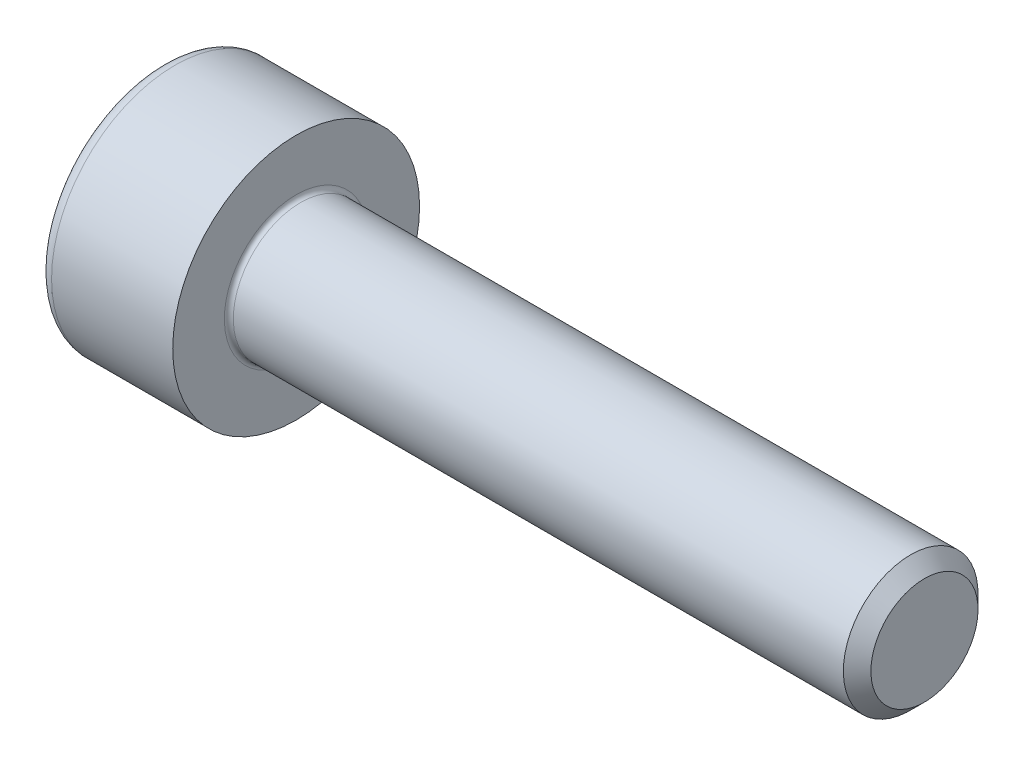
ISO-10303-21;
HEADER;
FILE_DESCRIPTION(('STEP AP214'),'2;1');
FILE_NAME('part.step','',(''),(''),'','','');
FILE_SCHEMA(('AUTOMOTIVE_DESIGN { 1 0 10303 214 1 1 1 1 }'));
ENDSEC;
DATA;
#1=APPLICATION_CONTEXT('core data for automotive mechanical design processes');
#2=APPLICATION_PROTOCOL_DEFINITION('international standard','automotive_design',2000,#1);
#3=PRODUCT_CONTEXT('',#1,'mechanical');
#4=PRODUCT('Part','Part','',(#3));
#5=PRODUCT_RELATED_PRODUCT_CATEGORY('part','',(#4));
#6=PRODUCT_DEFINITION_FORMATION('','',#4);
#7=PRODUCT_DEFINITION_CONTEXT('part definition',#1,'design');
#8=PRODUCT_DEFINITION('design','',#6,#7);
#9=PRODUCT_DEFINITION_SHAPE('','',#8);
#10=(LENGTH_UNIT() NAMED_UNIT(*) SI_UNIT(.MILLI.,.METRE.));
#11=(NAMED_UNIT(*) PLANE_ANGLE_UNIT() SI_UNIT($,.RADIAN.));
#12=(NAMED_UNIT(*) SI_UNIT($,.STERADIAN.) SOLID_ANGLE_UNIT());
#13=UNCERTAINTY_MEASURE_WITH_UNIT(LENGTH_MEASURE(1.E-05),#10,'distance_accuracy_value','');
#14=(GEOMETRIC_REPRESENTATION_CONTEXT(3) GLOBAL_UNCERTAINTY_ASSIGNED_CONTEXT((#13)) GLOBAL_UNIT_ASSIGNED_CONTEXT((#10,
#11,#12)) REPRESENTATION_CONTEXT('',''));
#15=CARTESIAN_POINT('',(0.,0.,0.));
#16=DIRECTION('',(0.,0.,1.));
#17=DIRECTION('',(1.,0.,0.));
#18=AXIS2_PLACEMENT_3D('',#15,#16,#17);
#19=CARTESIAN_POINT('',(0.100000000000002,0.,0.));
#20=DIRECTION('',(-1.,0.,0.));
#21=DIRECTION('',(0.,0.707106781186548,0.707106781186548));
#22=AXIS2_PLACEMENT_3D('',#19,#20,#21);
#23=TOROIDAL_SURFACE('',#22,1.6,0.1);
#24=CARTESIAN_POINT('',(0.,0.,0.));
#25=DIRECTION('',(1.,0.,0.));
#26=DIRECTION('',(0.,-1.,0.));
#27=AXIS2_PLACEMENT_3D('',#24,#25,#26);
#28=CIRCLE('',#27,1.6);
#29=CARTESIAN_POINT('',(0.,1.6,0.));
#30=VERTEX_POINT('',#29);
#31=EDGE_CURVE('E11',#30,#30,#28,.T.);
#32=ORIENTED_EDGE('',*,*,#31,.T.);
#33=EDGE_LOOP('',(#32));
#34=FACE_BOUND('',#33,.T.);
#35=CARTESIAN_POINT('',(0.100000000000002,0.,0.));
#36=DIRECTION('',(-1.,0.,0.));
#37=DIRECTION('',(0.,-1.,0.));
#38=AXIS2_PLACEMENT_3D('',#35,#36,#37);
#39=CIRCLE('',#38,1.5);
#40=CARTESIAN_POINT('',(0.100000000000002,1.5,0.));
#41=VERTEX_POINT('',#40);
#42=EDGE_CURVE('E29',#41,#41,#39,.T.);
#43=ORIENTED_EDGE('',*,*,#42,.T.);
#44=EDGE_LOOP('',(#43));
#45=FACE_BOUND('',#44,.T.);
#46=ADVANCED_FACE('F17',(#34,#45),#23,.F.);
#47=CARTESIAN_POINT('',(8.,0.,0.));
#48=DIRECTION('',(1.,0.,0.));
#49=DIRECTION('',(0.,1.,0.));
#50=AXIS2_PLACEMENT_3D('',#47,#48,#49);
#51=CYLINDRICAL_SURFACE('',#50,1.5);
#52=CARTESIAN_POINT('',(13.693275,0.,0.));
#53=DIRECTION('',(1.,0.,0.));
#54=DIRECTION('',(0.,-1.,0.));
#55=AXIS2_PLACEMENT_3D('',#52,#53,#54);
#56=CIRCLE('',#55,1.5);
#57=CARTESIAN_POINT('',(13.693275,1.5,0.));
#58=VERTEX_POINT('',#57);
#59=EDGE_CURVE('E241',#58,#58,#56,.T.);
#60=ORIENTED_EDGE('',*,*,#59,.F.);
#61=EDGE_LOOP('',(#60));
#62=FACE_BOUND('',#61,.T.);
#63=ORIENTED_EDGE('',*,*,#42,.F.);
#64=EDGE_LOOP('',(#63));
#65=FACE_BOUND('',#64,.T.);
#66=ADVANCED_FACE('F104',(#62,#65),#51,.T.);
#67=CARTESIAN_POINT('',(0.,2.125,0.));
#68=DIRECTION('',(1.,0.,0.));
#69=DIRECTION('',(0.,0.707106781186548,0.707106781186548));
#70=AXIS2_PLACEMENT_3D('',#67,#68,#69);
#71=PLANE('',#70);
#72=CARTESIAN_POINT('',(0.,0.,0.));
#73=DIRECTION('',(1.,0.,0.));
#74=DIRECTION('',(0.,1.,0.));
#75=AXIS2_PLACEMENT_3D('',#72,#73,#74);
#76=CIRCLE('',#75,2.75);
#77=CARTESIAN_POINT('',(0.,2.75,0.));
#78=VERTEX_POINT('',#77);
#79=EDGE_CURVE('E242',#78,#78,#76,.T.);
#80=ORIENTED_EDGE('',*,*,#79,.T.);
#81=EDGE_LOOP('',(#80));
#82=FACE_BOUND('',#81,.T.);
#83=ORIENTED_EDGE('',*,*,#31,.F.);
#84=EDGE_LOOP('',(#83));
#85=FACE_BOUND('',#84,.T.);
#86=ADVANCED_FACE('F110',(#82,#85),#71,.T.);
#87=CARTESIAN_POINT('',(13.8466375,0.,0.));
#88=DIRECTION('',(-1.,0.,0.));
#89=DIRECTION('',(0.,-1.,0.));
#90=AXIS2_PLACEMENT_3D('',#87,#88,#89);
#91=CONICAL_SURFACE('',#90,1.3466375,0.785398163397446);
#92=ORIENTED_EDGE('',*,*,#59,.T.);
#93=EDGE_LOOP('',(#92));
#94=FACE_BOUND('',#93,.T.);
#95=CARTESIAN_POINT('',(14.,0.,0.));
#96=DIRECTION('',(-1.,0.,0.));
#97=DIRECTION('',(0.,-1.,0.));
#98=AXIS2_PLACEMENT_3D('',#95,#96,#97);
#99=CIRCLE('',#98,1.193275);
#100=CARTESIAN_POINT('',(14.,1.193275,0.));
#101=VERTEX_POINT('',#100);
#102=EDGE_CURVE('E238',#101,#101,#99,.T.);
#103=ORIENTED_EDGE('',*,*,#102,.T.);
#104=EDGE_LOOP('',(#103));
#105=FACE_BOUND('',#104,.T.);
#106=ADVANCED_FACE('F117',(#94,#105),#91,.T.);
#107=CARTESIAN_POINT('',(14.,0.75,0.));
#108=DIRECTION('',(1.,0.,0.));
#109=DIRECTION('',(0.,0.707106781186548,0.707106781186548));
#110=AXIS2_PLACEMENT_3D('',#107,#108,#109);
#111=PLANE('',#110);
#112=ORIENTED_EDGE('',*,*,#102,.F.);
#113=EDGE_LOOP('',(#112));
#114=FACE_BOUND('',#113,.T.);
#115=ADVANCED_FACE('F121',(#114),#111,.T.);
#116=CARTESIAN_POINT('',(-2.7,0.,0.));
#117=DIRECTION('',(1.,0.,0.));
#118=DIRECTION('',(0.,0.707106781186548,0.707106781186548));
#119=AXIS2_PLACEMENT_3D('',#116,#117,#118);
#120=TOROIDAL_SURFACE('',#119,2.45,0.3);
#121=CARTESIAN_POINT('',(-3.,0.,0.));
#122=DIRECTION('',(1.,0.,0.));
#123=DIRECTION('',(0.,-1.,0.));
#124=AXIS2_PLACEMENT_3D('',#121,#122,#123);
#125=CIRCLE('',#124,2.45);
#126=CARTESIAN_POINT('',(-3.,2.45,0.));
#127=VERTEX_POINT('',#126);
#128=EDGE_CURVE('E235',#127,#127,#125,.T.);
#129=ORIENTED_EDGE('',*,*,#128,.T.);
#130=EDGE_LOOP('',(#129));
#131=FACE_BOUND('',#130,.T.);
#132=CARTESIAN_POINT('',(-2.7,0.,0.));
#133=DIRECTION('',(-1.,0.,0.));
#134=DIRECTION('',(0.,-1.,0.));
#135=AXIS2_PLACEMENT_3D('',#132,#133,#134);
#136=CIRCLE('',#135,2.75);
#137=CARTESIAN_POINT('',(-2.7,2.75,0.));
#138=VERTEX_POINT('',#137);
#139=EDGE_CURVE('E232',#138,#138,#136,.T.);
#140=ORIENTED_EDGE('',*,*,#139,.T.);
#141=EDGE_LOOP('',(#140));
#142=FACE_BOUND('',#141,.T.);
#143=ADVANCED_FACE('F125',(#131,#142),#120,.T.);
#144=CARTESIAN_POINT('',(-3.,2.09668783648703,0.));
#145=DIRECTION('',(-1.,0.,0.));
#146=DIRECTION('',(0.,0.707106781186548,0.707106781186548));
#147=AXIS2_PLACEMENT_3D('',#144,#145,#146);
#148=PLANE('',#147);
#149=DIRECTION('',(0.,0.,1.));
#150=VECTOR('',#149,1.);
#151=CARTESIAN_POINT('',(-3.,1.25,0.360843918243514));
#152=LINE('',#151,#150);
#153=CARTESIAN_POINT('',(-3.,1.25,-0.721687836487033));
#154=VERTEX_POINT('',#153);
#155=CARTESIAN_POINT('',(-3.,1.25,0.721687836487031));
#156=VERTEX_POINT('',#155);
#157=EDGE_CURVE('E229',#154,#156,#152,.T.);
#158=ORIENTED_EDGE('',*,*,#157,.T.);
#159=DIRECTION('',(0.,-0.866025403784438,0.5));
#160=VECTOR('',#159,1.);
#161=CARTESIAN_POINT('',(-3.,0.3125,1.26295371385231));
#162=LINE('',#161,#160);
#163=CARTESIAN_POINT('',(-3.,0.,1.44337567297406));
#164=VERTEX_POINT('',#163);
#165=EDGE_CURVE('E226',#156,#164,#162,.T.);
#166=ORIENTED_EDGE('',*,*,#165,.T.);
#167=DIRECTION('',(0.,-0.866025403784439,-0.5));
#168=VECTOR('',#167,1.);
#169=CARTESIAN_POINT('',(-3.,-0.9375,0.902109795608791));
#170=LINE('',#169,#168);
#171=CARTESIAN_POINT('',(-3.,-1.25,0.721687836487033));
#172=VERTEX_POINT('',#171);
#173=EDGE_CURVE('E223',#164,#172,#170,.T.);
#174=ORIENTED_EDGE('',*,*,#173,.T.);
#175=DIRECTION('',(0.,0.,-1.));
#176=VECTOR('',#175,1.);
#177=CARTESIAN_POINT('',(-3.,-1.25,-0.360843918243516));
#178=LINE('',#177,#176);
#179=CARTESIAN_POINT('',(-3.,-1.25,-0.721687836487032));
#180=VERTEX_POINT('',#179);
#181=EDGE_CURVE('E220',#172,#180,#178,.T.);
#182=ORIENTED_EDGE('',*,*,#181,.T.);
#183=DIRECTION('',(0.,0.866025403784439,-0.5));
#184=VECTOR('',#183,1.);
#185=CARTESIAN_POINT('',(-3.,-0.3125,-1.26295371385231));
#186=LINE('',#185,#184);
#187=CARTESIAN_POINT('',(-3.,0.,-1.44337567297406));
#188=VERTEX_POINT('',#187);
#189=EDGE_CURVE('E217',#180,#188,#186,.T.);
#190=ORIENTED_EDGE('',*,*,#189,.T.);
#191=DIRECTION('',(0.,0.866025403784439,0.5));
#192=VECTOR('',#191,1.);
#193=CARTESIAN_POINT('',(-3.,0.9375,-0.902109795608791));
#194=LINE('',#193,#192);
#195=EDGE_CURVE('E209',#188,#154,#194,.T.);
#196=ORIENTED_EDGE('',*,*,#195,.T.);
#197=EDGE_LOOP('',(#158,#166,#174,#182,#190,#196));
#198=FACE_BOUND('',#197,.T.);
#199=ORIENTED_EDGE('',*,*,#128,.F.);
#200=EDGE_LOOP('',(#199));
#201=FACE_BOUND('',#200,.T.);
#202=ADVANCED_FACE('F129',(#198,#201),#148,.T.);
#203=CARTESIAN_POINT('',(-1.5,0.,0.));
#204=DIRECTION('',(1.,0.,0.));
#205=DIRECTION('',(0.,1.,0.));
#206=AXIS2_PLACEMENT_3D('',#203,#204,#205);
#207=CYLINDRICAL_SURFACE('',#206,2.75);
#208=ORIENTED_EDGE('',*,*,#79,.F.);
#209=EDGE_LOOP('',(#208));
#210=FACE_BOUND('',#209,.T.);
#211=ORIENTED_EDGE('',*,*,#139,.F.);
#212=EDGE_LOOP('',(#211));
#213=FACE_BOUND('',#212,.T.);
#214=ADVANCED_FACE('F133',(#210,#213),#207,.T.);
#215=CARTESIAN_POINT('',(-3.,0.,-1.44337567297406));
#216=DIRECTION('',(0.,-0.5,-0.866025403784439));
#217=DIRECTION('',(0.447213595499958,-0.774596669241483,0.447213595499958));
#218=AXIS2_PLACEMENT_3D('',#215,#216,#217);
#219=PLANE('',#218);
#220=CARTESIAN_POINT('',(-1.7,0.,-1.44337567297406));
#221=CARTESIAN_POINT('',(-1.49166666666666,-0.625000000000001,-1.08253175473055));
#222=CARTESIAN_POINT('',(-1.7,-1.25,-0.721687836487032));
#223=(BOUNDED_CURVE() B_SPLINE_CURVE(2,(#220,#221,#222),.UNSPECIFIED.,.F.,
.F.) B_SPLINE_CURVE_WITH_KNOTS((3,3),(0.,0.14605451725974),
.UNSPECIFIED.) CURVE() GEOMETRIC_REPRESENTATION_ITEM() RATIONAL_B_SPLINE_CURVE((1.,
1.15470053837925,1.)) REPRESENTATION_ITEM(''));
#224=CARTESIAN_POINT('',(-1.7,0.,-1.44337567297406));
#225=VERTEX_POINT('',#224);
#226=CARTESIAN_POINT('',(-1.7,-1.25,-0.721687836487032));
#227=VERTEX_POINT('',#226);
#228=EDGE_CURVE('E164',#225,#227,#223,.T.);
#229=ORIENTED_EDGE('',*,*,#228,.F.);
#230=DIRECTION('',(-1.,0.,0.));
#231=VECTOR('',#230,1.);
#232=CARTESIAN_POINT('',(-2.35,0.,-1.44337567297406));
#233=LINE('',#232,#231);
#234=EDGE_CURVE('E200',#225,#188,#233,.T.);
#235=ORIENTED_EDGE('',*,*,#234,.T.);
#236=ORIENTED_EDGE('',*,*,#189,.F.);
#237=DIRECTION('',(-1.,0.,0.));
#238=VECTOR('',#237,1.);
#239=CARTESIAN_POINT('',(-2.35,-1.25,-0.721687836487033));
#240=LINE('',#239,#238);
#241=EDGE_CURVE('E160',#227,#180,#240,.T.);
#242=ORIENTED_EDGE('',*,*,#241,.F.);
#243=EDGE_LOOP('',(#229,#235,#236,#242));
#244=FACE_BOUND('',#243,.T.);
#245=ADVANCED_FACE('F137',(#244),#219,.F.);
#246=CARTESIAN_POINT('',(-3.,1.25,-0.721687836487033));
#247=DIRECTION('',(0.,0.5,-0.866025403784439));
#248=DIRECTION('',(0.654653670707977,0.654653670707977,0.377964473009227));
#249=AXIS2_PLACEMENT_3D('',#246,#247,#248);
#250=PLANE('',#249);
#251=CARTESIAN_POINT('',(-1.7,1.25,-0.721687836487032));
#252=CARTESIAN_POINT('',(-1.49166666666666,0.625,-1.08253175473055));
#253=CARTESIAN_POINT('',(-1.7,0.,-1.44337567297406));
#254=(BOUNDED_CURVE() B_SPLINE_CURVE(2,(#251,#252,#253),.UNSPECIFIED.,.F.,
.F.) B_SPLINE_CURVE_WITH_KNOTS((3,3),(0.,0.14605451725974),
.UNSPECIFIED.) CURVE() GEOMETRIC_REPRESENTATION_ITEM() RATIONAL_B_SPLINE_CURVE((1.,
1.15470053837925,1.)) REPRESENTATION_ITEM(''));
#255=CARTESIAN_POINT('',(-1.7,1.25,-0.721687836487035));
#256=VERTEX_POINT('',#255);
#257=EDGE_CURVE('E166',#256,#225,#254,.T.);
#258=ORIENTED_EDGE('',*,*,#257,.F.);
#259=DIRECTION('',(-1.,0.,0.));
#260=VECTOR('',#259,1.);
#261=CARTESIAN_POINT('',(-2.35,1.25,-0.721687836487034));
#262=LINE('',#261,#260);
#263=EDGE_CURVE('E191',#256,#154,#262,.T.);
#264=ORIENTED_EDGE('',*,*,#263,.T.);
#265=ORIENTED_EDGE('',*,*,#195,.F.);
#266=ORIENTED_EDGE('',*,*,#234,.F.);
#267=EDGE_LOOP('',(#258,#264,#265,#266));
#268=FACE_BOUND('',#267,.T.);
#269=ADVANCED_FACE('F141',(#268),#250,.F.);
#270=CARTESIAN_POINT('',(-3.,1.25,0.721687836487031));
#271=DIRECTION('',(0.,1.,0.));
#272=DIRECTION('',(0.707106781186548,0.,0.707106781186548));
#273=AXIS2_PLACEMENT_3D('',#270,#271,#272);
#274=PLANE('',#273);
#275=CARTESIAN_POINT('',(-1.7,1.25,0.721687836487032));
#276=CARTESIAN_POINT('',(-1.49166666666666,1.25,0.));
#277=CARTESIAN_POINT('',(-1.7,1.25,-0.721687836487035));
#278=(BOUNDED_CURVE() B_SPLINE_CURVE(2,(#275,#276,#277),.UNSPECIFIED.,.F.,
.F.) B_SPLINE_CURVE_WITH_KNOTS((3,3),(0.,0.14605451725974),
.UNSPECIFIED.) CURVE() GEOMETRIC_REPRESENTATION_ITEM() RATIONAL_B_SPLINE_CURVE((1.,
1.15470053837925,1.)) REPRESENTATION_ITEM(''));
#279=CARTESIAN_POINT('',(-1.7,1.25,0.72168783648703));
#280=VERTEX_POINT('',#279);
#281=EDGE_CURVE('E181',#280,#256,#278,.T.);
#282=ORIENTED_EDGE('',*,*,#281,.F.);
#283=DIRECTION('',(-1.,0.,0.));
#284=VECTOR('',#283,1.);
#285=CARTESIAN_POINT('',(-2.35,1.25,0.72168783648703));
#286=LINE('',#285,#284);
#287=EDGE_CURVE('E176',#280,#156,#286,.T.);
#288=ORIENTED_EDGE('',*,*,#287,.T.);
#289=ORIENTED_EDGE('',*,*,#157,.F.);
#290=ORIENTED_EDGE('',*,*,#263,.F.);
#291=EDGE_LOOP('',(#282,#288,#289,#290));
#292=FACE_BOUND('',#291,.T.);
#293=ADVANCED_FACE('F145',(#292),#274,.F.);
#294=CARTESIAN_POINT('',(-3.,0.,1.44337567297406));
#295=DIRECTION('',(0.,0.5,0.866025403784438));
#296=DIRECTION('',(0.447213595499959,-0.774596669241483,0.447213595499959));
#297=AXIS2_PLACEMENT_3D('',#294,#295,#296);
#298=PLANE('',#297);
#299=CARTESIAN_POINT('',(-1.7,0.,1.44337567297406));
#300=CARTESIAN_POINT('',(-1.49166666666666,0.625000000000001,1.08253175473055));
#301=CARTESIAN_POINT('',(-1.7,1.25,0.72168783648703));
#302=(BOUNDED_CURVE() B_SPLINE_CURVE(2,(#299,#300,#301),.UNSPECIFIED.,.F.,
.F.) B_SPLINE_CURVE_WITH_KNOTS((3,3),(0.,0.14605451725974),
.UNSPECIFIED.) CURVE() GEOMETRIC_REPRESENTATION_ITEM() RATIONAL_B_SPLINE_CURVE((1.,
1.15470053837925,1.)) REPRESENTATION_ITEM(''));
#303=CARTESIAN_POINT('',(-1.7,0.,1.44337567297406));
#304=VERTEX_POINT('',#303);
#305=EDGE_CURVE('E179',#304,#280,#302,.T.);
#306=ORIENTED_EDGE('',*,*,#305,.F.);
#307=DIRECTION('',(1.,0.,0.));
#308=VECTOR('',#307,1.);
#309=CARTESIAN_POINT('',(-2.35,0.,1.44337567297406));
#310=LINE('',#309,#308);
#311=EDGE_CURVE('E171',#164,#304,#310,.T.);
#312=ORIENTED_EDGE('',*,*,#311,.F.);
#313=ORIENTED_EDGE('',*,*,#165,.F.);
#314=ORIENTED_EDGE('',*,*,#287,.F.);
#315=EDGE_LOOP('',(#306,#312,#313,#314));
#316=FACE_BOUND('',#315,.T.);
#317=ADVANCED_FACE('F149',(#316),#298,.F.);
#318=CARTESIAN_POINT('',(-3.,-1.25,-0.721687836487032));
#319=DIRECTION('',(0.,-1.,0.));
#320=DIRECTION('',(0.707106781186548,0.,0.707106781186548));
#321=AXIS2_PLACEMENT_3D('',#318,#319,#320);
#322=PLANE('',#321);
#323=CARTESIAN_POINT('',(-1.7,-1.25,-0.721687836487034));
#324=CARTESIAN_POINT('',(-1.49166666666666,-1.25,0.));
#325=CARTESIAN_POINT('',(-1.7,-1.25,0.721687836487034));
#326=(BOUNDED_CURVE() B_SPLINE_CURVE(2,(#323,#324,#325),.UNSPECIFIED.,.F.,
.F.) B_SPLINE_CURVE_WITH_KNOTS((3,3),(0.,0.14605451725974),
.UNSPECIFIED.) CURVE() GEOMETRIC_REPRESENTATION_ITEM() RATIONAL_B_SPLINE_CURVE((1.,
1.15470053837925,1.)) REPRESENTATION_ITEM(''));
#327=CARTESIAN_POINT('',(-1.7,-1.25,0.721687836487032));
#328=VERTEX_POINT('',#327);
#329=EDGE_CURVE('E90',#227,#328,#326,.T.);
#330=ORIENTED_EDGE('',*,*,#329,.F.);
#331=ORIENTED_EDGE('',*,*,#241,.T.);
#332=ORIENTED_EDGE('',*,*,#181,.F.);
#333=DIRECTION('',(-1.,0.,0.));
#334=VECTOR('',#333,1.);
#335=CARTESIAN_POINT('',(-2.35,-1.25,0.721687836487032));
#336=LINE('',#335,#334);
#337=EDGE_CURVE('E162',#328,#172,#336,.T.);
#338=ORIENTED_EDGE('',*,*,#337,.F.);
#339=EDGE_LOOP('',(#330,#331,#332,#338));
#340=FACE_BOUND('',#339,.T.);
#341=ADVANCED_FACE('F100',(#340),#322,.F.);
#342=CARTESIAN_POINT('',(-3.,-1.25,0.721687836487033));
#343=DIRECTION('',(0.,-0.5,0.866025403784439));
#344=DIRECTION('',(0.654653670707977,0.654653670707977,0.377964473009227));
#345=AXIS2_PLACEMENT_3D('',#342,#343,#344);
#346=PLANE('',#345);
#347=CARTESIAN_POINT('',(-1.7,-1.25,0.721687836487032));
#348=CARTESIAN_POINT('',(-1.49166666666666,-0.625,1.08253175473055));
#349=CARTESIAN_POINT('',(-1.7,0.,1.44337567297406));
#350=(BOUNDED_CURVE() B_SPLINE_CURVE(2,(#347,#348,#349),.UNSPECIFIED.,.F.,
.F.) B_SPLINE_CURVE_WITH_KNOTS((3,3),(0.,0.14605451725974),
.UNSPECIFIED.) CURVE() GEOMETRIC_REPRESENTATION_ITEM() RATIONAL_B_SPLINE_CURVE((1.,
1.15470053837925,1.)) REPRESENTATION_ITEM(''));
#351=EDGE_CURVE('E21',#328,#304,#350,.T.);
#352=ORIENTED_EDGE('',*,*,#351,.F.);
#353=ORIENTED_EDGE('',*,*,#337,.T.);
#354=ORIENTED_EDGE('',*,*,#173,.F.);
#355=ORIENTED_EDGE('',*,*,#311,.T.);
#356=EDGE_LOOP('',(#352,#353,#354,#355));
#357=FACE_BOUND('',#356,.T.);
#358=ADVANCED_FACE('F95',(#357),#346,.F.);
#359=CARTESIAN_POINT('',(-1.28333333333333,0.,0.));
#360=DIRECTION('',(-1.,0.,0.));
#361=DIRECTION('',(0.,1.,0.));
#362=AXIS2_PLACEMENT_3D('',#359,#360,#361);
#363=CONICAL_SURFACE('',#362,0.721687836487032,1.0471975511966);
#364=ORIENTED_EDGE('',*,*,#305,.T.);
#365=ORIENTED_EDGE('',*,*,#281,.T.);
#366=ORIENTED_EDGE('',*,*,#257,.T.);
#367=ORIENTED_EDGE('',*,*,#228,.T.);
#368=ORIENTED_EDGE('',*,*,#329,.T.);
#369=ORIENTED_EDGE('',*,*,#351,.T.);
#370=EDGE_LOOP('',(#364,#365,#366,#367,#368,#369));
#371=FACE_BOUND('',#370,.T.);
#372=CARTESIAN_POINT('',(-0.86666666666666,0.,0.));
#373=VERTEX_POINT('',#372);
#374=VERTEX_LOOP('',#373);
#375=FACE_BOUND('',#374,.T.);
#376=ADVANCED_FACE('F19',(#371,#375),#363,.F.);
#377=CLOSED_SHELL('',(#46,#66,#86,#106,#115,#143,#202,#214,#245,#269,#293,#317,#341,#358,#376));
#378=MANIFOLD_SOLID_BREP('B1',#377);
#379=ADVANCED_BREP_SHAPE_REPRESENTATION('',(#18,#378),#14);
#380=SHAPE_DEFINITION_REPRESENTATION(#9,#379);
ENDSEC;
END-ISO-10303-21;
